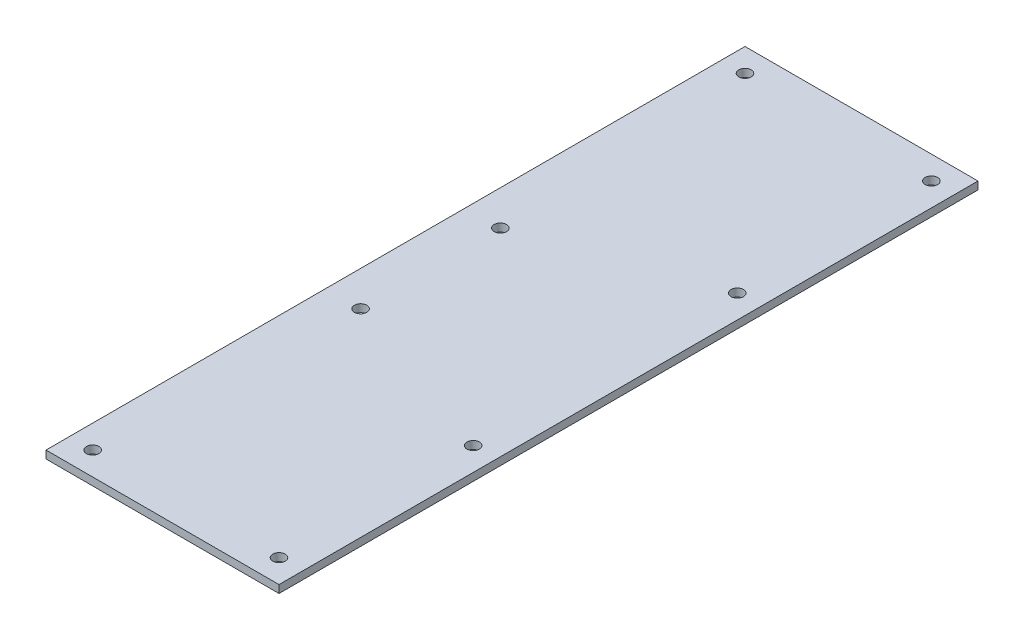
ISO-10303-21;
HEADER;
FILE_DESCRIPTION(('STEP AP214'),'2;1');
FILE_NAME('part.step','',(''),(''),'','','');
FILE_SCHEMA(('AUTOMOTIVE_DESIGN { 1 0 10303 214 1 1 1 1 }'));
ENDSEC;
DATA;
#1=APPLICATION_CONTEXT('core data for automotive mechanical design processes');
#2=APPLICATION_PROTOCOL_DEFINITION('international standard','automotive_design',2000,#1);
#3=PRODUCT_CONTEXT('',#1,'mechanical');
#4=PRODUCT('Part','Part','',(#3));
#5=PRODUCT_RELATED_PRODUCT_CATEGORY('part','',(#4));
#6=PRODUCT_DEFINITION_FORMATION('','',#4);
#7=PRODUCT_DEFINITION_CONTEXT('part definition',#1,'design');
#8=PRODUCT_DEFINITION('design','',#6,#7);
#9=PRODUCT_DEFINITION_SHAPE('','',#8);
#10=(LENGTH_UNIT() NAMED_UNIT(*) SI_UNIT(.MILLI.,.METRE.));
#11=(NAMED_UNIT(*) PLANE_ANGLE_UNIT() SI_UNIT($,.RADIAN.));
#12=(NAMED_UNIT(*) SI_UNIT($,.STERADIAN.) SOLID_ANGLE_UNIT());
#13=UNCERTAINTY_MEASURE_WITH_UNIT(LENGTH_MEASURE(1.E-05),#10,'distance_accuracy_value','');
#14=(GEOMETRIC_REPRESENTATION_CONTEXT(3) GLOBAL_UNCERTAINTY_ASSIGNED_CONTEXT((#13)) GLOBAL_UNIT_ASSIGNED_CONTEXT((#10,
#11,#12)) REPRESENTATION_CONTEXT('',''));
#15=CARTESIAN_POINT('',(0.,0.,0.));
#16=DIRECTION('',(0.,0.,1.));
#17=DIRECTION('',(1.,0.,0.));
#18=AXIS2_PLACEMENT_3D('',#15,#16,#17);
#19=CARTESIAN_POINT('',(0.,2.,0.));
#20=DIRECTION('',(0.,-1.,0.));
#21=DIRECTION('',(0.,0.,-1.));
#22=AXIS2_PLACEMENT_3D('',#19,#20,#21);
#23=PLANE('',#22);
#24=DIRECTION('',(0.,0.,1.));
#25=VECTOR('',#24,1.);
#26=CARTESIAN_POINT('',(0.,2.,0.));
#27=LINE('',#26,#25);
#28=CARTESIAN_POINT('',(0.,2.,-180.));
#29=VERTEX_POINT('',#28);
#30=CARTESIAN_POINT('',(0.,2.,0.));
#31=VERTEX_POINT('',#30);
#32=EDGE_CURVE('E87',#29,#31,#27,.T.);
#33=ORIENTED_EDGE('',*,*,#32,.T.);
#34=DIRECTION('',(1.,0.,0.));
#35=VECTOR('',#34,1.);
#36=CARTESIAN_POINT('',(0.,2.,0.));
#37=LINE('',#36,#35);
#38=CARTESIAN_POINT('',(60.,2.,0.));
#39=VERTEX_POINT('',#38);
#40=EDGE_CURVE('E82',#31,#39,#37,.T.);
#41=ORIENTED_EDGE('',*,*,#40,.T.);
#42=DIRECTION('',(0.,0.,-1.));
#43=VECTOR('',#42,1.);
#44=CARTESIAN_POINT('',(60.,2.,0.));
#45=LINE('',#44,#43);
#46=CARTESIAN_POINT('',(60.,2.,-180.));
#47=VERTEX_POINT('',#46);
#48=EDGE_CURVE('E85',#39,#47,#45,.T.);
#49=ORIENTED_EDGE('',*,*,#48,.T.);
#50=DIRECTION('',(-1.,0.,0.));
#51=VECTOR('',#50,1.);
#52=CARTESIAN_POINT('',(0.,2.,-180.));
#53=LINE('',#52,#51);
#54=EDGE_CURVE('E52',#47,#29,#53,.T.);
#55=ORIENTED_EDGE('',*,*,#54,.T.);
#56=EDGE_LOOP('',(#33,#41,#49,#55));
#57=FACE_BOUND('',#56,.T.);
#58=CARTESIAN_POINT('',(54.,2.,-56.));
#59=DIRECTION('',(0.,1.,0.));
#60=DIRECTION('',(0.,0.,1.));
#61=AXIS2_PLACEMENT_3D('',#58,#59,#60);
#62=CIRCLE('',#61,1.6);
#63=CARTESIAN_POINT('',(54.,2.,-54.4));
#64=VERTEX_POINT('',#63);
#65=EDGE_CURVE('E102',#64,#64,#62,.T.);
#66=ORIENTED_EDGE('',*,*,#65,.F.);
#67=EDGE_LOOP('',(#66));
#68=FACE_BOUND('',#67,.T.);
#69=CARTESIAN_POINT('',(54.,2.,-124.));
#70=DIRECTION('',(0.,1.,0.));
#71=DIRECTION('',(0.,0.,-1.));
#72=AXIS2_PLACEMENT_3D('',#69,#70,#71);
#73=CIRCLE('',#72,1.6);
#74=CARTESIAN_POINT('',(54.,2.,-125.6));
#75=VERTEX_POINT('',#74);
#76=EDGE_CURVE('E117',#75,#75,#73,.T.);
#77=ORIENTED_EDGE('',*,*,#76,.F.);
#78=EDGE_LOOP('',(#77));
#79=FACE_BOUND('',#78,.T.);
#80=CARTESIAN_POINT('',(8.99999999999999,2.,-108.));
#81=DIRECTION('',(0.,1.,0.));
#82=DIRECTION('',(0.,0.,1.));
#83=AXIS2_PLACEMENT_3D('',#80,#81,#82);
#84=CIRCLE('',#83,1.6);
#85=CARTESIAN_POINT('',(8.99999999999999,2.,-106.4));
#86=VERTEX_POINT('',#85);
#87=EDGE_CURVE('E123',#86,#86,#84,.T.);
#88=ORIENTED_EDGE('',*,*,#87,.F.);
#89=EDGE_LOOP('',(#88));
#90=FACE_BOUND('',#89,.T.);
#91=CARTESIAN_POINT('',(9.,2.,-72.));
#92=DIRECTION('',(0.,1.,0.));
#93=DIRECTION('',(0.,0.,-1.));
#94=AXIS2_PLACEMENT_3D('',#91,#92,#93);
#95=CIRCLE('',#94,1.60000000000001);
#96=CARTESIAN_POINT('',(9.,2.,-73.6));
#97=VERTEX_POINT('',#96);
#98=EDGE_CURVE('E129',#97,#97,#95,.T.);
#99=ORIENTED_EDGE('',*,*,#98,.F.);
#100=EDGE_LOOP('',(#99));
#101=FACE_BOUND('',#100,.T.);
#102=CARTESIAN_POINT('',(6.,2.,-174.));
#103=DIRECTION('',(0.,1.,0.));
#104=DIRECTION('',(0.,0.,1.));
#105=AXIS2_PLACEMENT_3D('',#102,#103,#104);
#106=CIRCLE('',#105,1.59999999999999);
#107=CARTESIAN_POINT('',(6.,2.,-172.4));
#108=VERTEX_POINT('',#107);
#109=EDGE_CURVE('E135',#108,#108,#106,.T.);
#110=ORIENTED_EDGE('',*,*,#109,.F.);
#111=EDGE_LOOP('',(#110));
#112=FACE_BOUND('',#111,.T.);
#113=CARTESIAN_POINT('',(53.9999999999999,2.,-174.));
#114=DIRECTION('',(0.,1.,0.));
#115=DIRECTION('',(0.,0.,-1.));
#116=AXIS2_PLACEMENT_3D('',#113,#114,#115);
#117=CIRCLE('',#116,1.59999999999998);
#118=CARTESIAN_POINT('',(53.9999999999999,2.,-175.6));
#119=VERTEX_POINT('',#118);
#120=EDGE_CURVE('E141',#119,#119,#117,.T.);
#121=ORIENTED_EDGE('',*,*,#120,.F.);
#122=EDGE_LOOP('',(#121));
#123=FACE_BOUND('',#122,.T.);
#124=CARTESIAN_POINT('',(54.,2.,-6.00000000000003));
#125=DIRECTION('',(0.,1.,0.));
#126=DIRECTION('',(0.,0.,1.));
#127=AXIS2_PLACEMENT_3D('',#124,#125,#126);
#128=CIRCLE('',#127,1.59999999999998);
#129=CARTESIAN_POINT('',(54.,2.,-4.40000000000006));
#130=VERTEX_POINT('',#129);
#131=EDGE_CURVE('E147',#130,#130,#128,.T.);
#132=ORIENTED_EDGE('',*,*,#131,.F.);
#133=EDGE_LOOP('',(#132));
#134=FACE_BOUND('',#133,.T.);
#135=CARTESIAN_POINT('',(6.00000000000004,2.,-6.00000000000001));
#136=DIRECTION('',(0.,1.,0.));
#137=DIRECTION('',(0.,0.,-1.));
#138=AXIS2_PLACEMENT_3D('',#135,#136,#137);
#139=CIRCLE('',#138,1.59999999999999);
#140=CARTESIAN_POINT('',(6.00000000000004,2.,-7.6));
#141=VERTEX_POINT('',#140);
#142=EDGE_CURVE('E153',#141,#141,#139,.T.);
#143=ORIENTED_EDGE('',*,*,#142,.F.);
#144=EDGE_LOOP('',(#143));
#145=FACE_BOUND('',#144,.T.);
#146=ADVANCED_FACE('F35',(#57,#68,#79,#90,#101,#112,#123,#134,#145),#23,.F.);
#147=CARTESIAN_POINT('',(0.,0.,0.));
#148=DIRECTION('',(0.,-1.,0.));
#149=DIRECTION('',(0.,0.,-1.));
#150=AXIS2_PLACEMENT_3D('',#147,#148,#149);
#151=PLANE('',#150);
#152=CARTESIAN_POINT('',(54.,0.,-6.00000000000003));
#153=DIRECTION('',(0.,1.,0.));
#154=DIRECTION('',(0.,0.,1.));
#155=AXIS2_PLACEMENT_3D('',#152,#153,#154);
#156=CIRCLE('',#155,1.59999999999998);
#157=CARTESIAN_POINT('',(54.,0.,-4.40000000000006));
#158=VERTEX_POINT('',#157);
#159=EDGE_CURVE('E150',#158,#158,#156,.T.);
#160=ORIENTED_EDGE('',*,*,#159,.T.);
#161=EDGE_LOOP('',(#160));
#162=FACE_BOUND('',#161,.T.);
#163=CARTESIAN_POINT('',(6.,0.,-174.));
#164=DIRECTION('',(0.,1.,0.));
#165=DIRECTION('',(0.,0.,1.));
#166=AXIS2_PLACEMENT_3D('',#163,#164,#165);
#167=CIRCLE('',#166,1.59999999999999);
#168=CARTESIAN_POINT('',(6.,0.,-172.4));
#169=VERTEX_POINT('',#168);
#170=EDGE_CURVE('E138',#169,#169,#167,.T.);
#171=ORIENTED_EDGE('',*,*,#170,.T.);
#172=EDGE_LOOP('',(#171));
#173=FACE_BOUND('',#172,.T.);
#174=CARTESIAN_POINT('',(8.99999999999999,0.,-108.));
#175=DIRECTION('',(0.,1.,0.));
#176=DIRECTION('',(0.,0.,1.));
#177=AXIS2_PLACEMENT_3D('',#174,#175,#176);
#178=CIRCLE('',#177,1.6);
#179=CARTESIAN_POINT('',(8.99999999999999,0.,-106.4));
#180=VERTEX_POINT('',#179);
#181=EDGE_CURVE('E126',#180,#180,#178,.T.);
#182=ORIENTED_EDGE('',*,*,#181,.T.);
#183=EDGE_LOOP('',(#182));
#184=FACE_BOUND('',#183,.T.);
#185=CARTESIAN_POINT('',(54.,0.,-56.));
#186=DIRECTION('',(0.,1.,0.));
#187=DIRECTION('',(0.,0.,1.));
#188=AXIS2_PLACEMENT_3D('',#185,#186,#187);
#189=CIRCLE('',#188,1.6);
#190=CARTESIAN_POINT('',(54.,0.,-54.4));
#191=VERTEX_POINT('',#190);
#192=EDGE_CURVE('E114',#191,#191,#189,.T.);
#193=ORIENTED_EDGE('',*,*,#192,.T.);
#194=EDGE_LOOP('',(#193));
#195=FACE_BOUND('',#194,.T.);
#196=DIRECTION('',(0.,0.,1.));
#197=VECTOR('',#196,1.);
#198=CARTESIAN_POINT('',(0.,0.,0.));
#199=LINE('',#198,#197);
#200=CARTESIAN_POINT('',(0.,0.,-180.));
#201=VERTEX_POINT('',#200);
#202=CARTESIAN_POINT('',(0.,0.,0.));
#203=VERTEX_POINT('',#202);
#204=EDGE_CURVE('E99',#201,#203,#199,.T.);
#205=ORIENTED_EDGE('',*,*,#204,.F.);
#206=DIRECTION('',(-1.,0.,0.));
#207=VECTOR('',#206,1.);
#208=CARTESIAN_POINT('',(0.,0.,-180.));
#209=LINE('',#208,#207);
#210=CARTESIAN_POINT('',(60.,0.,-180.));
#211=VERTEX_POINT('',#210);
#212=EDGE_CURVE('E75',#211,#201,#209,.T.);
#213=ORIENTED_EDGE('',*,*,#212,.F.);
#214=DIRECTION('',(0.,0.,-1.));
#215=VECTOR('',#214,1.);
#216=CARTESIAN_POINT('',(60.,0.,0.));
#217=LINE('',#216,#215);
#218=CARTESIAN_POINT('',(60.,0.,0.));
#219=VERTEX_POINT('',#218);
#220=EDGE_CURVE('E69',#219,#211,#217,.T.);
#221=ORIENTED_EDGE('',*,*,#220,.F.);
#222=DIRECTION('',(1.,0.,0.));
#223=VECTOR('',#222,1.);
#224=CARTESIAN_POINT('',(0.,0.,0.));
#225=LINE('',#224,#223);
#226=EDGE_CURVE('E91',#203,#219,#225,.T.);
#227=ORIENTED_EDGE('',*,*,#226,.F.);
#228=EDGE_LOOP('',(#205,#213,#221,#227));
#229=FACE_BOUND('',#228,.T.);
#230=CARTESIAN_POINT('',(54.,0.,-124.));
#231=DIRECTION('',(0.,1.,0.));
#232=DIRECTION('',(0.,0.,-1.));
#233=AXIS2_PLACEMENT_3D('',#230,#231,#232);
#234=CIRCLE('',#233,1.6);
#235=CARTESIAN_POINT('',(54.,0.,-125.6));
#236=VERTEX_POINT('',#235);
#237=EDGE_CURVE('E120',#236,#236,#234,.T.);
#238=ORIENTED_EDGE('',*,*,#237,.T.);
#239=EDGE_LOOP('',(#238));
#240=FACE_BOUND('',#239,.T.);
#241=CARTESIAN_POINT('',(9.,0.,-72.));
#242=DIRECTION('',(0.,1.,0.));
#243=DIRECTION('',(0.,0.,-1.));
#244=AXIS2_PLACEMENT_3D('',#241,#242,#243);
#245=CIRCLE('',#244,1.60000000000001);
#246=CARTESIAN_POINT('',(9.,0.,-73.6));
#247=VERTEX_POINT('',#246);
#248=EDGE_CURVE('E132',#247,#247,#245,.T.);
#249=ORIENTED_EDGE('',*,*,#248,.T.);
#250=EDGE_LOOP('',(#249));
#251=FACE_BOUND('',#250,.T.);
#252=CARTESIAN_POINT('',(53.9999999999999,0.,-174.));
#253=DIRECTION('',(0.,1.,0.));
#254=DIRECTION('',(0.,0.,-1.));
#255=AXIS2_PLACEMENT_3D('',#252,#253,#254);
#256=CIRCLE('',#255,1.59999999999998);
#257=CARTESIAN_POINT('',(53.9999999999999,0.,-175.6));
#258=VERTEX_POINT('',#257);
#259=EDGE_CURVE('E144',#258,#258,#256,.T.);
#260=ORIENTED_EDGE('',*,*,#259,.T.);
#261=EDGE_LOOP('',(#260));
#262=FACE_BOUND('',#261,.T.);
#263=CARTESIAN_POINT('',(6.00000000000004,0.,-6.00000000000001));
#264=DIRECTION('',(0.,1.,0.));
#265=DIRECTION('',(0.,0.,-1.));
#266=AXIS2_PLACEMENT_3D('',#263,#264,#265);
#267=CIRCLE('',#266,1.59999999999999);
#268=CARTESIAN_POINT('',(6.00000000000004,0.,-7.6));
#269=VERTEX_POINT('',#268);
#270=EDGE_CURVE('E156',#269,#269,#267,.T.);
#271=ORIENTED_EDGE('',*,*,#270,.T.);
#272=EDGE_LOOP('',(#271));
#273=FACE_BOUND('',#272,.T.);
#274=ADVANCED_FACE('F110',(#162,#173,#184,#195,#229,#240,#251,#262,#273),#151,.T.);
#275=CARTESIAN_POINT('',(0.,2.,0.));
#276=DIRECTION('',(1.,0.,0.));
#277=DIRECTION('',(0.,0.,-1.));
#278=AXIS2_PLACEMENT_3D('',#275,#276,#277);
#279=PLANE('',#278);
#280=ORIENTED_EDGE('',*,*,#204,.T.);
#281=DIRECTION('',(0.,-1.,0.));
#282=VECTOR('',#281,1.);
#283=CARTESIAN_POINT('',(0.,2.,0.));
#284=LINE('',#283,#282);
#285=EDGE_CURVE('E11',#31,#203,#284,.T.);
#286=ORIENTED_EDGE('',*,*,#285,.F.);
#287=ORIENTED_EDGE('',*,*,#32,.F.);
#288=DIRECTION('',(0.,-1.,0.));
#289=VECTOR('',#288,1.);
#290=CARTESIAN_POINT('',(0.,2.,-180.));
#291=LINE('',#290,#289);
#292=EDGE_CURVE('E95',#29,#201,#291,.T.);
#293=ORIENTED_EDGE('',*,*,#292,.T.);
#294=EDGE_LOOP('',(#280,#286,#287,#293));
#295=FACE_BOUND('',#294,.T.);
#296=ADVANCED_FACE('F37',(#295),#279,.F.);
#297=CARTESIAN_POINT('',(0.,2.,0.));
#298=DIRECTION('',(0.,0.,-1.));
#299=DIRECTION('',(-1.,0.,0.));
#300=AXIS2_PLACEMENT_3D('',#297,#298,#299);
#301=PLANE('',#300);
#302=ORIENTED_EDGE('',*,*,#226,.T.);
#303=DIRECTION('',(0.,-1.,0.));
#304=VECTOR('',#303,1.);
#305=CARTESIAN_POINT('',(60.,2.,0.));
#306=LINE('',#305,#304);
#307=EDGE_CURVE('E44',#39,#219,#306,.T.);
#308=ORIENTED_EDGE('',*,*,#307,.F.);
#309=ORIENTED_EDGE('',*,*,#40,.F.);
#310=ORIENTED_EDGE('',*,*,#285,.T.);
#311=EDGE_LOOP('',(#302,#308,#309,#310));
#312=FACE_BOUND('',#311,.T.);
#313=ADVANCED_FACE('F90',(#312),#301,.F.);
#314=CARTESIAN_POINT('',(60.,2.,0.));
#315=DIRECTION('',(-1.,0.,0.));
#316=DIRECTION('',(0.,0.,1.));
#317=AXIS2_PLACEMENT_3D('',#314,#315,#316);
#318=PLANE('',#317);
#319=ORIENTED_EDGE('',*,*,#220,.T.);
#320=DIRECTION('',(0.,-1.,0.));
#321=VECTOR('',#320,1.);
#322=CARTESIAN_POINT('',(60.,2.,-180.));
#323=LINE('',#322,#321);
#324=EDGE_CURVE('E92',#47,#211,#323,.T.);
#325=ORIENTED_EDGE('',*,*,#324,.F.);
#326=ORIENTED_EDGE('',*,*,#48,.F.);
#327=ORIENTED_EDGE('',*,*,#307,.T.);
#328=EDGE_LOOP('',(#319,#325,#326,#327));
#329=FACE_BOUND('',#328,.T.);
#330=ADVANCED_FACE('F93',(#329),#318,.F.);
#331=CARTESIAN_POINT('',(0.,2.,-180.));
#332=DIRECTION('',(0.,0.,1.));
#333=DIRECTION('',(1.,0.,0.));
#334=AXIS2_PLACEMENT_3D('',#331,#332,#333);
#335=PLANE('',#334);
#336=ORIENTED_EDGE('',*,*,#212,.T.);
#337=ORIENTED_EDGE('',*,*,#292,.F.);
#338=ORIENTED_EDGE('',*,*,#54,.F.);
#339=ORIENTED_EDGE('',*,*,#324,.T.);
#340=EDGE_LOOP('',(#336,#337,#338,#339));
#341=FACE_BOUND('',#340,.T.);
#342=ADVANCED_FACE('F107',(#341),#335,.F.);
#343=CARTESIAN_POINT('',(54.,2.,-56.));
#344=DIRECTION('',(0.,-1.,0.));
#345=DIRECTION('',(0.,0.,-1.));
#346=AXIS2_PLACEMENT_3D('',#343,#344,#345);
#347=CYLINDRICAL_SURFACE('',#346,1.6);
#348=ORIENTED_EDGE('',*,*,#65,.T.);
#349=EDGE_LOOP('',(#348));
#350=FACE_BOUND('',#349,.T.);
#351=ORIENTED_EDGE('',*,*,#192,.F.);
#352=EDGE_LOOP('',(#351));
#353=FACE_BOUND('',#352,.T.);
#354=ADVANCED_FACE('F173',(#350,#353),#347,.F.);
#355=CARTESIAN_POINT('',(54.,2.,-124.));
#356=DIRECTION('',(0.,-1.,0.));
#357=DIRECTION('',(0.,0.,-1.));
#358=AXIS2_PLACEMENT_3D('',#355,#356,#357);
#359=CYLINDRICAL_SURFACE('',#358,1.6);
#360=ORIENTED_EDGE('',*,*,#76,.T.);
#361=EDGE_LOOP('',(#360));
#362=FACE_BOUND('',#361,.T.);
#363=ORIENTED_EDGE('',*,*,#237,.F.);
#364=EDGE_LOOP('',(#363));
#365=FACE_BOUND('',#364,.T.);
#366=ADVANCED_FACE('F219',(#362,#365),#359,.F.);
#367=CARTESIAN_POINT('',(8.99999999999999,2.,-108.));
#368=DIRECTION('',(0.,-1.,0.));
#369=DIRECTION('',(0.,0.,-1.));
#370=AXIS2_PLACEMENT_3D('',#367,#368,#369);
#371=CYLINDRICAL_SURFACE('',#370,1.6);
#372=ORIENTED_EDGE('',*,*,#87,.T.);
#373=EDGE_LOOP('',(#372));
#374=FACE_BOUND('',#373,.T.);
#375=ORIENTED_EDGE('',*,*,#181,.F.);
#376=EDGE_LOOP('',(#375));
#377=FACE_BOUND('',#376,.T.);
#378=ADVANCED_FACE('F227',(#374,#377),#371,.F.);
#379=CARTESIAN_POINT('',(9.,2.,-72.));
#380=DIRECTION('',(0.,-1.,0.));
#381=DIRECTION('',(0.,0.,-1.));
#382=AXIS2_PLACEMENT_3D('',#379,#380,#381);
#383=CYLINDRICAL_SURFACE('',#382,1.60000000000001);
#384=ORIENTED_EDGE('',*,*,#98,.T.);
#385=EDGE_LOOP('',(#384));
#386=FACE_BOUND('',#385,.T.);
#387=ORIENTED_EDGE('',*,*,#248,.F.);
#388=EDGE_LOOP('',(#387));
#389=FACE_BOUND('',#388,.T.);
#390=ADVANCED_FACE('F235',(#386,#389),#383,.F.);
#391=CARTESIAN_POINT('',(6.,2.,-174.));
#392=DIRECTION('',(0.,-1.,0.));
#393=DIRECTION('',(0.,0.,-1.));
#394=AXIS2_PLACEMENT_3D('',#391,#392,#393);
#395=CYLINDRICAL_SURFACE('',#394,1.59999999999999);
#396=ORIENTED_EDGE('',*,*,#109,.T.);
#397=EDGE_LOOP('',(#396));
#398=FACE_BOUND('',#397,.T.);
#399=ORIENTED_EDGE('',*,*,#170,.F.);
#400=EDGE_LOOP('',(#399));
#401=FACE_BOUND('',#400,.T.);
#402=ADVANCED_FACE('F244',(#398,#401),#395,.F.);
#403=CARTESIAN_POINT('',(53.9999999999999,2.,-174.));
#404=DIRECTION('',(0.,-1.,0.));
#405=DIRECTION('',(0.,0.,-1.));
#406=AXIS2_PLACEMENT_3D('',#403,#404,#405);
#407=CYLINDRICAL_SURFACE('',#406,1.59999999999998);
#408=ORIENTED_EDGE('',*,*,#120,.T.);
#409=EDGE_LOOP('',(#408));
#410=FACE_BOUND('',#409,.T.);
#411=ORIENTED_EDGE('',*,*,#259,.F.);
#412=EDGE_LOOP('',(#411));
#413=FACE_BOUND('',#412,.T.);
#414=ADVANCED_FACE('F253',(#410,#413),#407,.F.);
#415=CARTESIAN_POINT('',(54.,2.,-6.00000000000003));
#416=DIRECTION('',(0.,-1.,0.));
#417=DIRECTION('',(0.,0.,-1.));
#418=AXIS2_PLACEMENT_3D('',#415,#416,#417);
#419=CYLINDRICAL_SURFACE('',#418,1.59999999999998);
#420=ORIENTED_EDGE('',*,*,#131,.T.);
#421=EDGE_LOOP('',(#420));
#422=FACE_BOUND('',#421,.T.);
#423=ORIENTED_EDGE('',*,*,#159,.F.);
#424=EDGE_LOOP('',(#423));
#425=FACE_BOUND('',#424,.T.);
#426=ADVANCED_FACE('F262',(#422,#425),#419,.F.);
#427=CARTESIAN_POINT('',(6.00000000000004,2.,-6.00000000000001));
#428=DIRECTION('',(0.,-1.,0.));
#429=DIRECTION('',(0.,0.,-1.));
#430=AXIS2_PLACEMENT_3D('',#427,#428,#429);
#431=CYLINDRICAL_SURFACE('',#430,1.59999999999999);
#432=ORIENTED_EDGE('',*,*,#142,.T.);
#433=EDGE_LOOP('',(#432));
#434=FACE_BOUND('',#433,.T.);
#435=ORIENTED_EDGE('',*,*,#270,.F.);
#436=EDGE_LOOP('',(#435));
#437=FACE_BOUND('',#436,.T.);
#438=ADVANCED_FACE('F162',(#434,#437),#431,.F.);
#439=CLOSED_SHELL('',(#146,#274,#296,#313,#330,#342,#354,#366,#378,#390,#402,#414,#426,#438));
#440=MANIFOLD_SOLID_BREP('B2',#439);
#441=ADVANCED_BREP_SHAPE_REPRESENTATION('',(#18,#440),#14);
#442=SHAPE_DEFINITION_REPRESENTATION(#9,#441);
ENDSEC;
END-ISO-10303-21;
